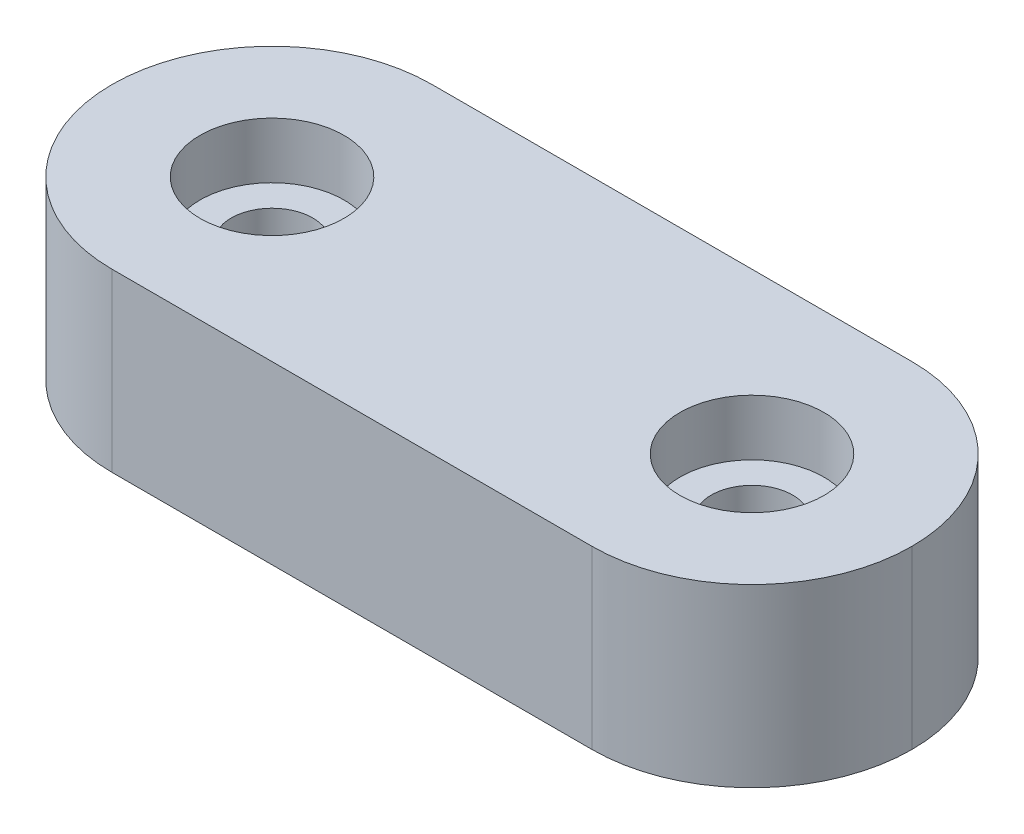
ISO-10303-21;
HEADER;
FILE_DESCRIPTION(('STEP AP214'),'2;1');
FILE_NAME('part.step','',(''),(''),'','','');
FILE_SCHEMA(('AUTOMOTIVE_DESIGN { 1 0 10303 214 1 1 1 1 }'));
ENDSEC;
DATA;
#1=APPLICATION_CONTEXT('core data for automotive mechanical design processes');
#2=APPLICATION_PROTOCOL_DEFINITION('international standard','automotive_design',2000,#1);
#3=PRODUCT_CONTEXT('',#1,'mechanical');
#4=PRODUCT('Part','Part','',(#3));
#5=PRODUCT_RELATED_PRODUCT_CATEGORY('part','',(#4));
#6=PRODUCT_DEFINITION_FORMATION('','',#4);
#7=PRODUCT_DEFINITION_CONTEXT('part definition',#1,'design');
#8=PRODUCT_DEFINITION('design','',#6,#7);
#9=PRODUCT_DEFINITION_SHAPE('','',#8);
#10=(LENGTH_UNIT() NAMED_UNIT(*) SI_UNIT(.MILLI.,.METRE.));
#11=(NAMED_UNIT(*) PLANE_ANGLE_UNIT() SI_UNIT($,.RADIAN.));
#12=(NAMED_UNIT(*) SI_UNIT($,.STERADIAN.) SOLID_ANGLE_UNIT());
#13=UNCERTAINTY_MEASURE_WITH_UNIT(LENGTH_MEASURE(1.E-05),#10,'distance_accuracy_value','');
#14=(GEOMETRIC_REPRESENTATION_CONTEXT(3) GLOBAL_UNCERTAINTY_ASSIGNED_CONTEXT((#13)) GLOBAL_UNIT_ASSIGNED_CONTEXT((#10,
#11,#12)) REPRESENTATION_CONTEXT('',''));
#15=CARTESIAN_POINT('',(0.,0.,0.));
#16=DIRECTION('',(0.,0.,1.));
#17=DIRECTION('',(1.,0.,0.));
#18=AXIS2_PLACEMENT_3D('',#15,#16,#17);
#19=CARTESIAN_POINT('',(30.,22.,0.));
#20=DIRECTION('',(0.,1.,0.));
#21=DIRECTION('',(0.,0.,1.));
#22=AXIS2_PLACEMENT_3D('',#19,#20,#21);
#23=CYLINDRICAL_SURFACE('',#22,5.09999999999999);
#24=CARTESIAN_POINT('',(30.,0.,0.));
#25=DIRECTION('',(0.,1.,0.));
#26=DIRECTION('',(0.,0.,1.));
#27=AXIS2_PLACEMENT_3D('',#24,#25,#26);
#28=CIRCLE('',#27,5.09999999999999);
#29=CARTESIAN_POINT('',(30.,0.,5.09999999999999));
#30=VERTEX_POINT('',#29);
#31=EDGE_CURVE('E155',#30,#30,#28,.T.);
#32=ORIENTED_EDGE('',*,*,#31,.F.);
#33=EDGE_LOOP('',(#32));
#34=FACE_BOUND('',#33,.T.);
#35=CARTESIAN_POINT('',(30.,15.,0.));
#36=DIRECTION('',(0.,1.,0.));
#37=DIRECTION('',(0.,0.,1.));
#38=AXIS2_PLACEMENT_3D('',#35,#36,#37);
#39=CIRCLE('',#38,5.09999999999999);
#40=CARTESIAN_POINT('',(30.,15.,5.09999999999999));
#41=VERTEX_POINT('',#40);
#42=EDGE_CURVE('E168',#41,#41,#39,.F.);
#43=ORIENTED_EDGE('',*,*,#42,.F.);
#44=EDGE_LOOP('',(#43));
#45=FACE_BOUND('',#44,.T.);
#46=ADVANCED_FACE('F50',(#34,#45),#23,.F.);
#47=CARTESIAN_POINT('',(-30.,22.,0.));
#48=DIRECTION('',(0.,1.,0.));
#49=DIRECTION('',(0.,0.,1.));
#50=AXIS2_PLACEMENT_3D('',#47,#48,#49);
#51=CYLINDRICAL_SURFACE('',#50,5.09999999999999);
#52=CARTESIAN_POINT('',(-30.,0.,0.));
#53=DIRECTION('',(0.,1.,0.));
#54=DIRECTION('',(0.,0.,1.));
#55=AXIS2_PLACEMENT_3D('',#52,#53,#54);
#56=CIRCLE('',#55,5.09999999999999);
#57=CARTESIAN_POINT('',(-30.,0.,5.1));
#58=VERTEX_POINT('',#57);
#59=EDGE_CURVE('E158',#58,#58,#56,.T.);
#60=ORIENTED_EDGE('',*,*,#59,.F.);
#61=EDGE_LOOP('',(#60));
#62=FACE_BOUND('',#61,.T.);
#63=CARTESIAN_POINT('',(-30.,15.,0.));
#64=DIRECTION('',(0.,1.,0.));
#65=DIRECTION('',(0.,0.,1.));
#66=AXIS2_PLACEMENT_3D('',#63,#64,#65);
#67=CIRCLE('',#66,5.09999999999999);
#68=CARTESIAN_POINT('',(-30.,15.,5.1));
#69=VERTEX_POINT('',#68);
#70=EDGE_CURVE('E169',#69,#69,#67,.F.);
#71=ORIENTED_EDGE('',*,*,#70,.F.);
#72=EDGE_LOOP('',(#71));
#73=FACE_BOUND('',#72,.T.);
#74=ADVANCED_FACE('F178',(#62,#73),#51,.F.);
#75=CARTESIAN_POINT('',(50.,22.,20.));
#76=DIRECTION('',(0.,0.,-1.));
#77=DIRECTION('',(-1.,0.,0.));
#78=AXIS2_PLACEMENT_3D('',#75,#76,#77);
#79=PLANE('',#78);
#80=DIRECTION('',(1.,0.,0.));
#81=VECTOR('',#80,1.);
#82=CARTESIAN_POINT('',(50.,0.,20.));
#83=LINE('',#82,#81);
#84=CARTESIAN_POINT('',(-30.,0.,20.));
#85=VERTEX_POINT('',#84);
#86=CARTESIAN_POINT('',(30.,0.,20.));
#87=VERTEX_POINT('',#86);
#88=EDGE_CURVE('E114',#85,#87,#83,.T.);
#89=ORIENTED_EDGE('',*,*,#88,.T.);
#90=DIRECTION('',(0.,-1.,0.));
#91=VECTOR('',#90,1.);
#92=CARTESIAN_POINT('',(30.,22.,20.));
#93=LINE('',#92,#91);
#94=CARTESIAN_POINT('',(30.,22.,20.));
#95=VERTEX_POINT('',#94);
#96=EDGE_CURVE('E132',#87,#95,#93,.F.);
#97=ORIENTED_EDGE('',*,*,#96,.T.);
#98=DIRECTION('',(1.,0.,0.));
#99=VECTOR('',#98,1.);
#100=CARTESIAN_POINT('',(50.,22.,20.));
#101=LINE('',#100,#99);
#102=CARTESIAN_POINT('',(-30.,22.,20.));
#103=VERTEX_POINT('',#102);
#104=EDGE_CURVE('E159',#103,#95,#101,.T.);
#105=ORIENTED_EDGE('',*,*,#104,.F.);
#106=DIRECTION('',(0.,-1.,0.));
#107=VECTOR('',#106,1.);
#108=CARTESIAN_POINT('',(-30.,22.,20.));
#109=LINE('',#108,#107);
#110=EDGE_CURVE('E130',#103,#85,#109,.T.);
#111=ORIENTED_EDGE('',*,*,#110,.T.);
#112=EDGE_LOOP('',(#89,#97,#105,#111));
#113=FACE_BOUND('',#112,.T.);
#114=ADVANCED_FACE('F184',(#113),#79,.F.);
#115=CARTESIAN_POINT('',(50.,22.,-20.));
#116=DIRECTION('',(0.,0.,1.));
#117=DIRECTION('',(1.,0.,0.));
#118=AXIS2_PLACEMENT_3D('',#115,#116,#117);
#119=PLANE('',#118);
#120=DIRECTION('',(-1.,0.,0.));
#121=VECTOR('',#120,1.);
#122=CARTESIAN_POINT('',(50.,22.,-20.));
#123=LINE('',#122,#121);
#124=CARTESIAN_POINT('',(30.,22.,-20.));
#125=VERTEX_POINT('',#124);
#126=CARTESIAN_POINT('',(-30.,22.,-20.));
#127=VERTEX_POINT('',#126);
#128=EDGE_CURVE('E117',#125,#127,#123,.T.);
#129=ORIENTED_EDGE('',*,*,#128,.F.);
#130=DIRECTION('',(0.,-1.,0.));
#131=VECTOR('',#130,1.);
#132=CARTESIAN_POINT('',(30.,22.,-20.));
#133=LINE('',#132,#131);
#134=CARTESIAN_POINT('',(30.,0.,-20.));
#135=VERTEX_POINT('',#134);
#136=EDGE_CURVE('E12',#125,#135,#133,.T.);
#137=ORIENTED_EDGE('',*,*,#136,.T.);
#138=DIRECTION('',(-1.,0.,0.));
#139=VECTOR('',#138,1.);
#140=CARTESIAN_POINT('',(50.,0.,-20.));
#141=LINE('',#140,#139);
#142=CARTESIAN_POINT('',(-30.,0.,-20.));
#143=VERTEX_POINT('',#142);
#144=EDGE_CURVE('E162',#135,#143,#141,.T.);
#145=ORIENTED_EDGE('',*,*,#144,.T.);
#146=DIRECTION('',(0.,-1.,0.));
#147=VECTOR('',#146,1.);
#148=CARTESIAN_POINT('',(-30.,22.,-20.));
#149=LINE('',#148,#147);
#150=EDGE_CURVE('E59',#143,#127,#149,.F.);
#151=ORIENTED_EDGE('',*,*,#150,.T.);
#152=EDGE_LOOP('',(#129,#137,#145,#151));
#153=FACE_BOUND('',#152,.T.);
#154=ADVANCED_FACE('F193',(#153),#119,.F.);
#155=CARTESIAN_POINT('',(0.,22.,0.));
#156=DIRECTION('',(0.,1.,0.));
#157=DIRECTION('',(0.,0.,1.));
#158=AXIS2_PLACEMENT_3D('',#155,#156,#157);
#159=PLANE('',#158);
#160=CARTESIAN_POINT('',(30.,22.,0.));
#161=DIRECTION('',(0.,1.,0.));
#162=DIRECTION('',(0.,0.,1.));
#163=AXIS2_PLACEMENT_3D('',#160,#161,#162);
#164=CIRCLE('',#163,9.);
#165=CARTESIAN_POINT('',(30.,22.,9.00000000000001));
#166=VERTEX_POINT('',#165);
#167=EDGE_CURVE('E151',#166,#166,#164,.T.);
#168=ORIENTED_EDGE('',*,*,#167,.F.);
#169=EDGE_LOOP('',(#168));
#170=FACE_BOUND('',#169,.T.);
#171=CARTESIAN_POINT('',(-30.,22.,0.));
#172=DIRECTION('',(0.,1.,0.));
#173=DIRECTION('',(0.,0.,1.));
#174=AXIS2_PLACEMENT_3D('',#171,#172,#173);
#175=CIRCLE('',#174,9.);
#176=CARTESIAN_POINT('',(-30.,22.,9.00000000000001));
#177=VERTEX_POINT('',#176);
#178=EDGE_CURVE('E141',#177,#177,#175,.T.);
#179=ORIENTED_EDGE('',*,*,#178,.F.);
#180=EDGE_LOOP('',(#179));
#181=FACE_BOUND('',#180,.T.);
#182=ORIENTED_EDGE('',*,*,#104,.T.);
#183=CARTESIAN_POINT('',(30.,22.,0.));
#184=DIRECTION('',(0.,1.,0.));
#185=DIRECTION('',(0.,0.,1.));
#186=AXIS2_PLACEMENT_3D('',#183,#184,#185);
#187=CIRCLE('',#186,20.);
#188=CARTESIAN_POINT('',(50.,22.,0.));
#189=VERTEX_POINT('',#188);
#190=EDGE_CURVE('E138',#95,#189,#187,.T.);
#191=ORIENTED_EDGE('',*,*,#190,.T.);
#192=CARTESIAN_POINT('',(30.,22.,0.));
#193=DIRECTION('',(0.,1.,0.));
#194=DIRECTION('',(0.,0.,1.));
#195=AXIS2_PLACEMENT_3D('',#192,#193,#194);
#196=CIRCLE('',#195,20.);
#197=EDGE_CURVE('E75',#189,#125,#196,.T.);
#198=ORIENTED_EDGE('',*,*,#197,.T.);
#199=ORIENTED_EDGE('',*,*,#128,.T.);
#200=CARTESIAN_POINT('',(-30.,22.,0.));
#201=DIRECTION('',(0.,1.,0.));
#202=DIRECTION('',(0.,0.,1.));
#203=AXIS2_PLACEMENT_3D('',#200,#201,#202);
#204=CIRCLE('',#203,20.);
#205=CARTESIAN_POINT('',(-50.,22.,0.));
#206=VERTEX_POINT('',#205);
#207=EDGE_CURVE('E67',#127,#206,#204,.T.);
#208=ORIENTED_EDGE('',*,*,#207,.T.);
#209=CARTESIAN_POINT('',(-30.,22.,0.));
#210=DIRECTION('',(0.,1.,0.));
#211=DIRECTION('',(0.,0.,1.));
#212=AXIS2_PLACEMENT_3D('',#209,#210,#211);
#213=CIRCLE('',#212,20.);
#214=EDGE_CURVE('E120',#206,#103,#213,.T.);
#215=ORIENTED_EDGE('',*,*,#214,.T.);
#216=EDGE_LOOP('',(#182,#191,#198,#199,#208,#215));
#217=FACE_BOUND('',#216,.T.);
#218=ADVANCED_FACE('F190',(#170,#181,#217),#159,.T.);
#219=CARTESIAN_POINT('',(0.,0.,0.));
#220=DIRECTION('',(0.,1.,0.));
#221=DIRECTION('',(0.,0.,1.));
#222=AXIS2_PLACEMENT_3D('',#219,#220,#221);
#223=PLANE('',#222);
#224=ORIENTED_EDGE('',*,*,#59,.T.);
#225=EDGE_LOOP('',(#224));
#226=FACE_BOUND('',#225,.T.);
#227=ORIENTED_EDGE('',*,*,#31,.T.);
#228=EDGE_LOOP('',(#227));
#229=FACE_BOUND('',#228,.T.);
#230=CARTESIAN_POINT('',(30.,0.,0.));
#231=DIRECTION('',(0.,1.,0.));
#232=DIRECTION('',(0.,0.,1.));
#233=AXIS2_PLACEMENT_3D('',#230,#231,#232);
#234=CIRCLE('',#233,20.);
#235=CARTESIAN_POINT('',(50.,0.,0.));
#236=VERTEX_POINT('',#235);
#237=EDGE_CURVE('E123',#135,#236,#234,.F.);
#238=ORIENTED_EDGE('',*,*,#237,.T.);
#239=CARTESIAN_POINT('',(30.,0.,0.));
#240=DIRECTION('',(0.,1.,0.));
#241=DIRECTION('',(0.,0.,1.));
#242=AXIS2_PLACEMENT_3D('',#239,#240,#241);
#243=CIRCLE('',#242,20.);
#244=EDGE_CURVE('E125',#236,#87,#243,.F.);
#245=ORIENTED_EDGE('',*,*,#244,.T.);
#246=ORIENTED_EDGE('',*,*,#88,.F.);
#247=CARTESIAN_POINT('',(-30.,0.,0.));
#248=DIRECTION('',(0.,1.,0.));
#249=DIRECTION('',(0.,0.,1.));
#250=AXIS2_PLACEMENT_3D('',#247,#248,#249);
#251=CIRCLE('',#250,20.);
#252=CARTESIAN_POINT('',(-50.,0.,0.));
#253=VERTEX_POINT('',#252);
#254=EDGE_CURVE('E106',#85,#253,#251,.F.);
#255=ORIENTED_EDGE('',*,*,#254,.T.);
#256=CARTESIAN_POINT('',(-30.,0.,0.));
#257=DIRECTION('',(0.,1.,0.));
#258=DIRECTION('',(0.,0.,1.));
#259=AXIS2_PLACEMENT_3D('',#256,#257,#258);
#260=CIRCLE('',#259,20.);
#261=EDGE_CURVE('E111',#253,#143,#260,.F.);
#262=ORIENTED_EDGE('',*,*,#261,.T.);
#263=ORIENTED_EDGE('',*,*,#144,.F.);
#264=EDGE_LOOP('',(#238,#245,#246,#255,#262,#263));
#265=FACE_BOUND('',#264,.T.);
#266=ADVANCED_FACE('F108',(#226,#229,#265),#223,.F.);
#267=CARTESIAN_POINT('',(-30.,15.,0.));
#268=DIRECTION('',(0.,1.,0.));
#269=DIRECTION('',(0.,0.,1.));
#270=AXIS2_PLACEMENT_3D('',#267,#268,#269);
#271=PLANE('',#270);
#272=CARTESIAN_POINT('',(-30.,15.,0.));
#273=DIRECTION('',(0.,1.,0.));
#274=DIRECTION('',(0.,0.,1.));
#275=AXIS2_PLACEMENT_3D('',#272,#273,#274);
#276=CIRCLE('',#275,9.);
#277=CARTESIAN_POINT('',(-30.,15.,9.00000000000001));
#278=VERTEX_POINT('',#277);
#279=EDGE_CURVE('E146',#278,#278,#276,.T.);
#280=ORIENTED_EDGE('',*,*,#279,.T.);
#281=EDGE_LOOP('',(#280));
#282=FACE_BOUND('',#281,.T.);
#283=ORIENTED_EDGE('',*,*,#70,.T.);
#284=EDGE_LOOP('',(#283));
#285=FACE_BOUND('',#284,.T.);
#286=ADVANCED_FACE('F197',(#282,#285),#271,.T.);
#287=CARTESIAN_POINT('',(-30.,15.,0.));
#288=DIRECTION('',(0.,1.,0.));
#289=DIRECTION('',(0.,0.,1.));
#290=AXIS2_PLACEMENT_3D('',#287,#288,#289);
#291=CYLINDRICAL_SURFACE('',#290,9.);
#292=ORIENTED_EDGE('',*,*,#279,.F.);
#293=EDGE_LOOP('',(#292));
#294=FACE_BOUND('',#293,.T.);
#295=ORIENTED_EDGE('',*,*,#178,.T.);
#296=EDGE_LOOP('',(#295));
#297=FACE_BOUND('',#296,.T.);
#298=ADVANCED_FACE('F242',(#294,#297),#291,.F.);
#299=CARTESIAN_POINT('',(30.,15.,0.));
#300=DIRECTION('',(0.,1.,0.));
#301=DIRECTION('',(0.,0.,1.));
#302=AXIS2_PLACEMENT_3D('',#299,#300,#301);
#303=PLANE('',#302);
#304=CARTESIAN_POINT('',(30.,15.,0.));
#305=DIRECTION('',(0.,1.,0.));
#306=DIRECTION('',(0.,0.,1.));
#307=AXIS2_PLACEMENT_3D('',#304,#305,#306);
#308=CIRCLE('',#307,9.);
#309=CARTESIAN_POINT('',(30.,15.,9.00000000000001));
#310=VERTEX_POINT('',#309);
#311=EDGE_CURVE('E171',#310,#310,#308,.T.);
#312=ORIENTED_EDGE('',*,*,#311,.T.);
#313=EDGE_LOOP('',(#312));
#314=FACE_BOUND('',#313,.T.);
#315=ORIENTED_EDGE('',*,*,#42,.T.);
#316=EDGE_LOOP('',(#315));
#317=FACE_BOUND('',#316,.T.);
#318=ADVANCED_FACE('F175',(#314,#317),#303,.T.);
#319=CARTESIAN_POINT('',(30.,15.,0.));
#320=DIRECTION('',(0.,1.,0.));
#321=DIRECTION('',(0.,0.,1.));
#322=AXIS2_PLACEMENT_3D('',#319,#320,#321);
#323=CYLINDRICAL_SURFACE('',#322,9.);
#324=ORIENTED_EDGE('',*,*,#311,.F.);
#325=EDGE_LOOP('',(#324));
#326=FACE_BOUND('',#325,.T.);
#327=ORIENTED_EDGE('',*,*,#167,.T.);
#328=EDGE_LOOP('',(#327));
#329=FACE_BOUND('',#328,.T.);
#330=ADVANCED_FACE('F210',(#326,#329),#323,.F.);
#331=CARTESIAN_POINT('',(30.,22.,0.));
#332=DIRECTION('',(0.,-1.,0.));
#333=DIRECTION('',(0.,0.,-1.));
#334=AXIS2_PLACEMENT_3D('',#331,#332,#333);
#335=CYLINDRICAL_SURFACE('',#334,20.);
#336=ORIENTED_EDGE('',*,*,#136,.F.);
#337=ORIENTED_EDGE('',*,*,#197,.F.);
#338=DIRECTION('',(0.,-1.,0.));
#339=VECTOR('',#338,1.);
#340=CARTESIAN_POINT('',(50.,22.,0.));
#341=LINE('',#340,#339);
#342=EDGE_CURVE('E121',#236,#189,#341,.F.);
#343=ORIENTED_EDGE('',*,*,#342,.F.);
#344=ORIENTED_EDGE('',*,*,#237,.F.);
#345=EDGE_LOOP('',(#336,#337,#343,#344));
#346=FACE_BOUND('',#345,.T.);
#347=ADVANCED_FACE('F208',(#346),#335,.T.);
#348=CARTESIAN_POINT('',(30.,22.,0.));
#349=DIRECTION('',(0.,-1.,0.));
#350=DIRECTION('',(0.,0.,-1.));
#351=AXIS2_PLACEMENT_3D('',#348,#349,#350);
#352=CYLINDRICAL_SURFACE('',#351,20.);
#353=ORIENTED_EDGE('',*,*,#190,.F.);
#354=ORIENTED_EDGE('',*,*,#96,.F.);
#355=ORIENTED_EDGE('',*,*,#244,.F.);
#356=ORIENTED_EDGE('',*,*,#342,.T.);
#357=EDGE_LOOP('',(#353,#354,#355,#356));
#358=FACE_BOUND('',#357,.T.);
#359=ADVANCED_FACE('F205',(#358),#352,.T.);
#360=CARTESIAN_POINT('',(-30.,22.,0.));
#361=DIRECTION('',(0.,-1.,0.));
#362=DIRECTION('',(0.,0.,-1.));
#363=AXIS2_PLACEMENT_3D('',#360,#361,#362);
#364=CYLINDRICAL_SURFACE('',#363,20.);
#365=ORIENTED_EDGE('',*,*,#110,.F.);
#366=ORIENTED_EDGE('',*,*,#214,.F.);
#367=DIRECTION('',(0.,-1.,0.));
#368=VECTOR('',#367,1.);
#369=CARTESIAN_POINT('',(-50.,22.,0.));
#370=LINE('',#369,#368);
#371=EDGE_CURVE('E54',#253,#206,#370,.F.);
#372=ORIENTED_EDGE('',*,*,#371,.F.);
#373=ORIENTED_EDGE('',*,*,#254,.F.);
#374=EDGE_LOOP('',(#365,#366,#372,#373));
#375=FACE_BOUND('',#374,.T.);
#376=ADVANCED_FACE('F52',(#375),#364,.T.);
#377=CARTESIAN_POINT('',(-30.,22.,0.));
#378=DIRECTION('',(0.,-1.,0.));
#379=DIRECTION('',(0.,0.,-1.));
#380=AXIS2_PLACEMENT_3D('',#377,#378,#379);
#381=CYLINDRICAL_SURFACE('',#380,20.);
#382=ORIENTED_EDGE('',*,*,#207,.F.);
#383=ORIENTED_EDGE('',*,*,#150,.F.);
#384=ORIENTED_EDGE('',*,*,#261,.F.);
#385=ORIENTED_EDGE('',*,*,#371,.T.);
#386=EDGE_LOOP('',(#382,#383,#384,#385));
#387=FACE_BOUND('',#386,.T.);
#388=ADVANCED_FACE('F122',(#387),#381,.T.);
#389=CLOSED_SHELL('',(#46,#74,#114,#154,#218,#266,#286,#298,#318,#330,#347,#359,#376,#388));
#390=MANIFOLD_SOLID_BREP('B2',#389);
#391=ADVANCED_BREP_SHAPE_REPRESENTATION('',(#18,#390),#14);
#392=SHAPE_DEFINITION_REPRESENTATION(#9,#391);
ENDSEC;
END-ISO-10303-21;
